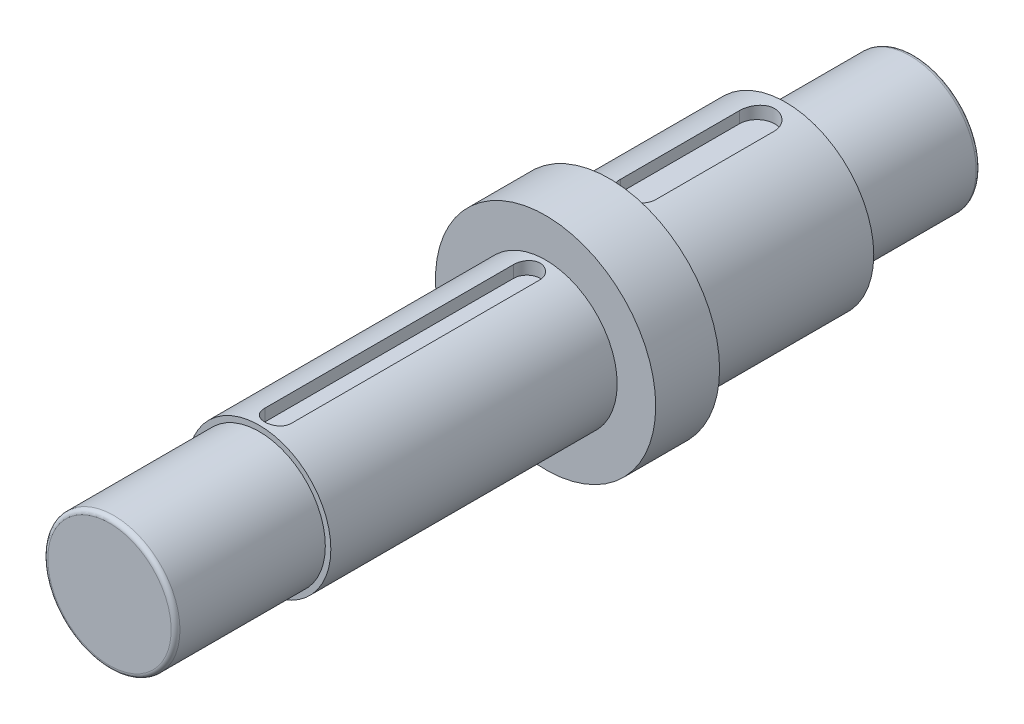
ISO-10303-21;
HEADER;
FILE_DESCRIPTION(('STEP AP214'),'2;1');
FILE_NAME('part.step','',(''),(''),'','','');
FILE_SCHEMA(('AUTOMOTIVE_DESIGN { 1 0 10303 214 1 1 1 1 }'));
ENDSEC;
DATA;
#1=APPLICATION_CONTEXT('core data for automotive mechanical design processes');
#2=APPLICATION_PROTOCOL_DEFINITION('international standard','automotive_design',2000,#1);
#3=PRODUCT_CONTEXT('',#1,'mechanical');
#4=PRODUCT('Part','Part','',(#3));
#5=PRODUCT_RELATED_PRODUCT_CATEGORY('part','',(#4));
#6=PRODUCT_DEFINITION_FORMATION('','',#4);
#7=PRODUCT_DEFINITION_CONTEXT('part definition',#1,'design');
#8=PRODUCT_DEFINITION('design','',#6,#7);
#9=PRODUCT_DEFINITION_SHAPE('','',#8);
#10=(LENGTH_UNIT() NAMED_UNIT(*) SI_UNIT(.MILLI.,.METRE.));
#11=(NAMED_UNIT(*) PLANE_ANGLE_UNIT() SI_UNIT($,.RADIAN.));
#12=(NAMED_UNIT(*) SI_UNIT($,.STERADIAN.) SOLID_ANGLE_UNIT());
#13=UNCERTAINTY_MEASURE_WITH_UNIT(LENGTH_MEASURE(1.E-05),#10,'distance_accuracy_value','');
#14=(GEOMETRIC_REPRESENTATION_CONTEXT(3) GLOBAL_UNCERTAINTY_ASSIGNED_CONTEXT((#13)) GLOBAL_UNIT_ASSIGNED_CONTEXT((#10,
#11,#12)) REPRESENTATION_CONTEXT('',''));
#15=CARTESIAN_POINT('',(0.,0.,0.));
#16=DIRECTION('',(0.,0.,1.));
#17=DIRECTION('',(1.,0.,0.));
#18=AXIS2_PLACEMENT_3D('',#15,#16,#17);
#19=CARTESIAN_POINT('',(0.,0.,0.));
#20=DIRECTION('',(0.,0.,1.));
#21=DIRECTION('',(1.,0.,0.));
#22=AXIS2_PLACEMENT_3D('',#19,#20,#21);
#23=CYLINDRICAL_SURFACE('',#22,32.5);
#24=CARTESIAN_POINT('',(0.,0.,167.5));
#25=DIRECTION('',(0.,0.,1.));
#26=DIRECTION('',(1.,0.,0.));
#27=AXIS2_PLACEMENT_3D('',#24,#25,#26);
#28=CIRCLE('',#27,32.5);
#29=CARTESIAN_POINT('',(32.5,0.,167.5));
#30=VERTEX_POINT('',#29);
#31=EDGE_CURVE('E171',#30,#30,#28,.T.);
#32=ORIENTED_EDGE('',*,*,#31,.T.);
#33=EDGE_LOOP('',(#32));
#34=FACE_BOUND('',#33,.T.);
#35=CARTESIAN_POINT('',(0.,0.,297.5));
#36=DIRECTION('',(0.,0.,1.));
#37=DIRECTION('',(1.,0.,0.));
#38=AXIS2_PLACEMENT_3D('',#35,#36,#37);
#39=CIRCLE('',#38,32.5);
#40=CARTESIAN_POINT('',(32.5,0.,297.5));
#41=VERTEX_POINT('',#40);
#42=EDGE_CURVE('E172',#41,#41,#39,.T.);
#43=ORIENTED_EDGE('',*,*,#42,.F.);
#44=EDGE_LOOP('',(#43));
#45=FACE_BOUND('',#44,.T.);
#46=CARTESIAN_POINT('',(5.99999999999991,31.9413525073689,176.));
#47=CARTESIAN_POINT('',(6.00001972804641,31.9413387857947,175.832781755872));
#48=CARTESIAN_POINT('',(5.9930103732358,31.9426651643651,175.665568298779));
#49=CARTESIAN_POINT('',(5.96507748310387,31.9478985744651,175.33236641655));
#50=CARTESIAN_POINT('',(5.94415550928292,31.951805316384,175.16637785605));
#51=CARTESIAN_POINT('',(5.88858022552652,31.9620927431616,174.837033794825));
#52=CARTESIAN_POINT('',(5.85394617497402,31.9684699578331,174.673674934018));
#53=CARTESIAN_POINT('',(5.77122142179083,31.9835079502799,174.350509489182));
#54=CARTESIAN_POINT('',(5.72313069754881,31.9921687317226,174.190702910859));
#55=CARTESIAN_POINT('',(5.6138585652119,32.0115239309396,173.87576503055));
#56=CARTESIAN_POINT('',(5.55267764101723,32.0222182735384,173.720633555985));
#57=CARTESIAN_POINT('',(5.41765280752458,32.0453386476663,173.41604968961));
#58=CARTESIAN_POINT('',(5.34380421506806,32.0577653193071,173.26659942316));
#59=CARTESIAN_POINT('',(5.18401841837613,32.0839913654135,172.974498719593));
#60=CARTESIAN_POINT('',(5.09808515477464,32.0977902919789,172.831846086089));
#61=CARTESIAN_POINT('',(4.91468141870748,32.126383548917,172.554190990731));
#62=CARTESIAN_POINT('',(4.81720664599399,32.1411782494131,172.419191408204));
#63=CARTESIAN_POINT('',(4.61035013215909,32.1715045920759,172.156444905818));
#64=CARTESIAN_POINT('',(4.500855772139,32.187042269054,172.028787333283));
#65=CARTESIAN_POINT('',(4.27151002693483,32.2182804790527,171.783075009634));
#66=CARTESIAN_POINT('',(4.15165482004194,32.2339810702705,171.665023833381));
#67=CARTESIAN_POINT('',(3.90246404243743,32.2650977553358,171.439405957197));
#68=CARTESIAN_POINT('',(3.77313048808002,32.280513908824,171.331837038625));
#69=CARTESIAN_POINT('',(3.50578787076281,32.3106414262999,171.127861732948));
#70=CARTESIAN_POINT('',(3.36777562726992,32.3253525283815,171.031459475376));
#71=CARTESIAN_POINT('',(3.08306099946307,32.3537531221654,170.84990878919));
#72=CARTESIAN_POINT('',(2.936304463415,32.3674347266049,170.764844016585));
#73=CARTESIAN_POINT('',(2.63595403307188,32.39327817288,170.607365279224));
#74=CARTESIAN_POINT('',(2.48235760661719,32.4054394454306,170.534956049293));
#75=CARTESIAN_POINT('',(2.16953912880609,32.4278842146267,170.403404977647));
#76=CARTESIAN_POINT('',(2.01031985951629,32.43816862479,170.344256678271));
#77=CARTESIAN_POINT('',(1.6872662257965,32.4565758245332,170.239620637345));
#78=CARTESIAN_POINT('',(1.52343020954708,32.4646978292852,170.19413785482));
#79=CARTESIAN_POINT('',(1.19428937290297,32.4784619635949,170.117662795038));
#80=CARTESIAN_POINT('',(1.02902285551296,32.4841314254946,170.08651054924));
#81=CARTESIAN_POINT('',(0.696389660835666,32.4929641670952,170.038180964307));
#82=CARTESIAN_POINT('',(0.529022963736015,32.4961274231355,170.021003757107));
#83=CARTESIAN_POINT('',(0.193419088173478,32.4998576642738,170.000762755366));
#84=CARTESIAN_POINT('',(0.0251819603747735,32.5004247988165,169.997698148437));
#85=CARTESIAN_POINT('',(-0.310943540652088,32.4989470467579,170.005704820769));
#86=CARTESIAN_POINT('',(-0.4788319159249,32.4969021755137,170.016776016919));
#87=CARTESIAN_POINT('',(-0.811000792294051,32.4902991463823,170.052744707521));
#88=CARTESIAN_POINT('',(-0.975300336608197,32.4857718718836,170.077472330134));
#89=CARTESIAN_POINT('',(-1.3012016725665,32.4743508081301,170.140442175259));
#90=CARTESIAN_POINT('',(-1.46280351116901,32.4674570601131,170.178684162273));
#91=CARTESIAN_POINT('',(-1.78221456789494,32.4514913115269,170.268400289348));
#92=CARTESIAN_POINT('',(-1.94002302319782,32.4424188768056,170.319877066883));
#93=CARTESIAN_POINT('',(-2.25067218859326,32.422348706553,170.435654353196));
#94=CARTESIAN_POINT('',(-2.40351461351373,32.4113516441784,170.499950379413));
#95=CARTESIAN_POINT('',(-2.70413221736005,32.3876602669359,170.641322955232));
#96=CARTESIAN_POINT('',(-2.85187246890169,32.3749563872849,170.718472164102));
#97=CARTESIAN_POINT('',(-3.14028729035266,32.3482544525693,170.884700366781));
#98=CARTESIAN_POINT('',(-3.28096432628655,32.3342568541064,170.973775156549));
#99=CARTESIAN_POINT('',(-3.55442520770943,32.3053397564869,171.163291713638));
#100=CARTESIAN_POINT('',(-3.68720582162271,32.2904198849195,171.26373808656));
#101=CARTESIAN_POINT('',(-3.94388427294111,32.2600755738219,171.475243396471));
#102=CARTESIAN_POINT('',(-4.06778521841465,32.2446513136185,171.586298588086));
#103=CARTESIAN_POINT('',(-4.30773837389128,32.2134793446507,171.820063598722));
#104=CARTESIAN_POINT('',(-4.42364336885938,32.1977302742279,171.942924401806));
#105=CARTESIAN_POINT('',(-4.64466655714656,32.166590238664,172.197956367049));
#106=CARTESIAN_POINT('',(-4.74978862891945,32.1511991463148,172.330124152576));
#107=CARTESIAN_POINT('',(-4.94862562431096,32.1211958688334,172.60299810796));
#108=CARTESIAN_POINT('',(-5.04233297220692,32.1065842045683,172.743709856458));
#109=CARTESIAN_POINT('',(-5.21755652220308,32.0785750424357,173.03257199706));
#110=CARTESIAN_POINT('',(-5.29907734790028,32.0651770848488,173.180719539362));
#111=CARTESIAN_POINT('',(-5.4495670127457,32.0399447422428,173.483866269052));
#112=CARTESIAN_POINT('',(-5.51850301951117,32.0281144685451,173.638882103259));
#113=CARTESIAN_POINT('',(-5.64301783414208,32.0064110019808,173.954253678406));
#114=CARTESIAN_POINT('',(-5.69860183057835,31.996537049153,174.114607317412));
#115=CARTESIAN_POINT('',(-5.79596382074337,31.9790439211199,174.439386223656));
#116=CARTESIAN_POINT('',(-5.83775626999942,31.9714223859376,174.60380703229));
#117=CARTESIAN_POINT('',(-5.90726811971032,31.9586519303727,174.935623501661));
#118=CARTESIAN_POINT('',(-5.9349942414404,31.9535018291353,175.103017701979));
#119=CARTESIAN_POINT('',(-5.97038248093272,31.9469053541025,175.392231253542));
#120=CARTESIAN_POINT('',(-5.98149459292176,31.9448246568417,175.513625510117));
#121=CARTESIAN_POINT('',(-5.99629903533955,31.9420477031673,175.756676055159));
#122=CARTESIAN_POINT('',(-6.00000382610286,31.9413491218277,175.878331558387));
#123=CARTESIAN_POINT('',(-5.99999999999999,31.9413525073689,176.));
#124=B_SPLINE_CURVE_WITH_KNOTS('',3,(#46,#47,#48,#49,#50,#51,#52,#53,#54,#55,#56,#57,#58,#59,
#60,#61,#62,#63,#64,#65,#66,#67,#68,#69,#70,#71,#72,#73,#74,#75,#76,#77,#78,#79,#80,#81,#82,#83,
#84,#85,#86,#87,#88,#89,#90,#91,#92,#93,#94,#95,#96,#97,#98,#99,#100,#101,#102,#103,#104,#105,
#106,#107,#108,#109,#110,#111,#112,#113,#114,#115,#116,#117,#118,#119,#120,#121,#122,#123),
.UNSPECIFIED.,.F.,.F.,(4,2,2,2,2,2,2,2,2,2,2,2,2,2,2,2,2,2,2,2,2,2,2,2,2,2,2,2,2,2,2,2,2,2,2,2,
2,2,4),(0.,0.501495470760242,1.00293466504055,1.50367204425038,2.0044102276453,2.50512990364764,
3.00603509315038,3.50677732194071,4.0077067127393,4.51381178473909,5.02010434213718,
5.52628950547204,6.03266126710335,6.54258387789146,7.05269685982352,7.5625608904048,
8.07260972061943,8.57681791670589,9.08103087289818,9.58521480389387,10.0893957705871,
10.5874420693422,11.0854796896586,11.5836166376145,12.08157970439,12.5824597292726,
13.083163645103,13.5840710813184,14.0848023244559,14.5931139762334,15.1012421501451,
15.6097057420661,16.117975929331,16.6275537557709,17.136933239535,17.6457771118127,
18.1543776150575,18.5199145679152,18.8848361083195),.UNSPECIFIED.);
#125=CARTESIAN_POINT('',(5.99999999999994,31.9413525073689,176.));
#126=VERTEX_POINT('',#125);
#127=CARTESIAN_POINT('',(-5.99999999999996,31.9413525073689,176.));
#128=VERTEX_POINT('',#127);
#129=EDGE_CURVE('E11',#126,#128,#124,.T.);
#130=ORIENTED_EDGE('',*,*,#129,.F.);
#131=DIRECTION('',(0.,0.,1.));
#132=VECTOR('',#131,1.);
#133=CARTESIAN_POINT('',(5.99999999999991,31.9413525073689,0.));
#134=LINE('',#133,#132);
#135=CARTESIAN_POINT('',(5.99999999999991,31.9413525073689,289.));
#136=VERTEX_POINT('',#135);
#137=EDGE_CURVE('E233',#136,#126,#134,.F.);
#138=ORIENTED_EDGE('',*,*,#137,.F.);
#139=CARTESIAN_POINT('',(-5.99999999999997,31.9413525073689,289.));
#140=CARTESIAN_POINT('',(-6.00001972804647,31.9413387857947,289.167218244128));
#141=CARTESIAN_POINT('',(-5.99301037323586,31.9426651643651,289.334431701221));
#142=CARTESIAN_POINT('',(-5.96507748310392,31.9478985744651,289.66763358345));
#143=CARTESIAN_POINT('',(-5.94415550928297,31.951805316384,289.83362214395));
#144=CARTESIAN_POINT('',(-5.88858022552657,31.9620927431616,290.162966205175));
#145=CARTESIAN_POINT('',(-5.85394617497407,31.9684699578331,290.326325065982));
#146=CARTESIAN_POINT('',(-5.77122142179087,31.9835079502799,290.649490510818));
#147=CARTESIAN_POINT('',(-5.72313069754886,31.9921687317226,290.809297089141));
#148=CARTESIAN_POINT('',(-5.61385856521194,32.0115239309396,291.12423496945));
#149=CARTESIAN_POINT('',(-5.55267764101726,32.0222182735384,291.279366444015));
#150=CARTESIAN_POINT('',(-5.41765280752461,32.0453386476662,291.58395031039));
#151=CARTESIAN_POINT('',(-5.34380421506808,32.0577653193071,291.733400576841));
#152=CARTESIAN_POINT('',(-5.18401841837614,32.0839913654135,292.025501280407));
#153=CARTESIAN_POINT('',(-5.09808515477463,32.0977902919789,292.168153913911));
#154=CARTESIAN_POINT('',(-4.91468141870748,32.126383548917,292.445809009269));
#155=CARTESIAN_POINT('',(-4.81720664599399,32.1411782494131,292.580808591796));
#156=CARTESIAN_POINT('',(-4.61035013215911,32.1715045920759,292.843555094182));
#157=CARTESIAN_POINT('',(-4.50085577213901,32.187042269054,292.971212666717));
#158=CARTESIAN_POINT('',(-4.27151002693485,32.2182804790527,293.216924990366));
#159=CARTESIAN_POINT('',(-4.15165482004196,32.2339810702705,293.33497616662));
#160=CARTESIAN_POINT('',(-3.90246404243746,32.2650977553358,293.560594042803));
#161=CARTESIAN_POINT('',(-3.77313048808004,32.280513908824,293.668162961375));
#162=CARTESIAN_POINT('',(-3.50578787076284,32.3106414262999,293.872138267052));
#163=CARTESIAN_POINT('',(-3.36777562726996,32.3253525283815,293.968540524624));
#164=CARTESIAN_POINT('',(-3.08306099946311,32.3537531221654,294.15009121081));
#165=CARTESIAN_POINT('',(-2.93630446341504,32.3674347266048,294.235155983415));
#166=CARTESIAN_POINT('',(-2.6359540330719,32.39327817288,294.392634720776));
#167=CARTESIAN_POINT('',(-2.48235760661721,32.4054394454306,294.465043950707));
#168=CARTESIAN_POINT('',(-2.1695391288061,32.4278842146267,294.596595022353));
#169=CARTESIAN_POINT('',(-2.0103198595163,32.43816862479,294.655743321729));
#170=CARTESIAN_POINT('',(-1.68726622579652,32.4565758245332,294.760379362655));
#171=CARTESIAN_POINT('',(-1.52343020954711,32.4646978292852,294.80586214518));
#172=CARTESIAN_POINT('',(-1.19428937290301,32.4784619635949,294.882337204962));
#173=CARTESIAN_POINT('',(-1.029022855513,32.4841314254946,294.91348945076));
#174=CARTESIAN_POINT('',(-0.696389660835696,32.4929641670952,294.961819035693));
#175=CARTESIAN_POINT('',(-0.529022963736039,32.4961274231355,294.978996242893));
#176=CARTESIAN_POINT('',(-0.193419088173493,32.4998576642738,294.999237244634));
#177=CARTESIAN_POINT('',(-0.0251819603747849,32.5004247988165,295.002301851563));
#178=CARTESIAN_POINT('',(0.310943540652082,32.4989470467579,294.994295179231));
#179=CARTESIAN_POINT('',(0.478831915924895,32.4969021755137,294.983223983081));
#180=CARTESIAN_POINT('',(0.811000792294054,32.4902991463823,294.947255292478));
#181=CARTESIAN_POINT('',(0.975300336608206,32.4857718718836,294.922527669866));
#182=CARTESIAN_POINT('',(1.30120167256651,32.4743508081301,294.859557824741));
#183=CARTESIAN_POINT('',(1.46280351116901,32.4674570601131,294.821315837727));
#184=CARTESIAN_POINT('',(1.78221456789493,32.4514913115269,294.731599710652));
#185=CARTESIAN_POINT('',(1.9400230231978,32.4424188768056,294.680122933117));
#186=CARTESIAN_POINT('',(2.25067218859324,32.422348706553,294.564345646804));
#187=CARTESIAN_POINT('',(2.40351461351371,32.4113516441784,294.500049620587));
#188=CARTESIAN_POINT('',(2.70413221736002,32.3876602669359,294.358677044768));
#189=CARTESIAN_POINT('',(2.85187246890166,32.3749563872849,294.281527835897));
#190=CARTESIAN_POINT('',(3.14028729035262,32.3482544525693,294.115299633219));
#191=CARTESIAN_POINT('',(3.28096432628651,32.3342568541064,294.026224843451));
#192=CARTESIAN_POINT('',(3.55442520770939,32.3053397564869,293.836708286362));
#193=CARTESIAN_POINT('',(3.68720582162266,32.2904198849195,293.73626191344));
#194=CARTESIAN_POINT('',(3.94388427294107,32.2600755738219,293.524756603529));
#195=CARTESIAN_POINT('',(4.06778521841462,32.2446513136185,293.413701411914));
#196=CARTESIAN_POINT('',(4.30773837389127,32.2134793446507,293.179936401278));
#197=CARTESIAN_POINT('',(4.42364336885937,32.1977302742279,293.057075598194));
#198=CARTESIAN_POINT('',(4.64466655714654,32.166590238664,292.802043632951));
#199=CARTESIAN_POINT('',(4.74978862891943,32.1511991463148,292.669875847424));
#200=CARTESIAN_POINT('',(4.94862562431094,32.1211958688334,292.39700189204));
#201=CARTESIAN_POINT('',(5.04233297220689,32.1065842045684,292.256290143541));
#202=CARTESIAN_POINT('',(5.21755652220306,32.0785750424357,291.96742800294));
#203=CARTESIAN_POINT('',(5.29907734790027,32.0651770848488,291.819280460638));
#204=CARTESIAN_POINT('',(5.44956701274567,32.0399447422428,291.516133730948));
#205=CARTESIAN_POINT('',(5.51850301951113,32.0281144685451,291.361117896741));
#206=CARTESIAN_POINT('',(5.64301783414201,32.0064110019808,291.045746321594));
#207=CARTESIAN_POINT('',(5.6986018305783,31.996537049153,290.885392682588));
#208=CARTESIAN_POINT('',(5.79596382074332,31.9790439211199,290.560613776344));
#209=CARTESIAN_POINT('',(5.83775626999936,31.9714223859376,290.39619296771));
#210=CARTESIAN_POINT('',(5.90726811971026,31.9586519303727,290.064376498339));
#211=CARTESIAN_POINT('',(5.93499424144035,31.9535018291353,289.896982298021));
#212=CARTESIAN_POINT('',(5.97038248093266,31.9469053541026,289.607768746458));
#213=CARTESIAN_POINT('',(5.9814945929217,31.9448246568418,289.486374489883));
#214=CARTESIAN_POINT('',(5.9962990353395,31.9420477031673,289.243323944841));
#215=CARTESIAN_POINT('',(6.00000382610281,31.9413491218277,289.121668441613));
#216=CARTESIAN_POINT('',(5.99999999999993,31.9413525073689,289.));
#217=B_SPLINE_CURVE_WITH_KNOTS('',3,(#139,#140,#141,#142,#143,#144,#145,#146,#147,#148,#149,
#150,#151,#152,#153,#154,#155,#156,#157,#158,#159,#160,#161,#162,#163,#164,#165,#166,#167,#168,
#169,#170,#171,#172,#173,#174,#175,#176,#177,#178,#179,#180,#181,#182,#183,#184,#185,#186,#187,
#188,#189,#190,#191,#192,#193,#194,#195,#196,#197,#198,#199,#200,#201,#202,#203,#204,#205,#206,
#207,#208,#209,#210,#211,#212,#213,#214,#215,#216),.UNSPECIFIED.,.F.,.F.,(4,2,2,2,2,2,2,2,2,2,2,
2,2,2,2,2,2,2,2,2,2,2,2,2,2,2,2,2,2,2,2,2,2,2,2,2,2,2,4),(0.,0.501495470760297,1.00293466504058,
1.50367204425046,2.00441022764533,2.5051299036477,3.00603509315047,3.50677732194082,
4.00770671273937,4.51381178473916,5.02010434213722,5.52628950547208,6.03266126710339,
6.54258387789147,7.05269685982357,7.56256089040485,8.07260972061946,8.5768179167059,
9.08103087289821,9.58521480389392,10.0893957705872,10.5874420693423,11.0854796896587,
11.5836166376145,12.0815797043901,12.5824597292726,13.083163645103,13.5840710813184,
14.0848023244559,14.5931139762334,15.1012421501452,15.6097057420662,16.117975929331,
16.6275537557709,17.1369332395349,17.6457771118127,18.1543776150576,18.5199145679151,
18.8848361083195),.UNSPECIFIED.);
#218=CARTESIAN_POINT('',(-5.99999999999997,31.9413525073689,289.));
#219=VERTEX_POINT('',#218);
#220=EDGE_CURVE('E234',#219,#136,#217,.T.);
#221=ORIENTED_EDGE('',*,*,#220,.F.);
#222=DIRECTION('',(0.,0.,1.));
#223=VECTOR('',#222,1.);
#224=CARTESIAN_POINT('',(-5.99999999999999,31.9413525073689,0.));
#225=LINE('',#224,#223);
#226=EDGE_CURVE('E51',#128,#219,#225,.T.);
#227=ORIENTED_EDGE('',*,*,#226,.F.);
#228=EDGE_LOOP('',(#130,#138,#221,#227));
#229=FACE_BOUND('',#228,.T.);
#230=ADVANCED_FACE('F40',(#34,#45,#229),#23,.T.);
#231=CARTESIAN_POINT('',(0.,0.,0.));
#232=DIRECTION('',(0.,0.,1.));
#233=DIRECTION('',(1.,0.,0.));
#234=AXIS2_PLACEMENT_3D('',#231,#232,#233);
#235=CYLINDRICAL_SURFACE('',#234,40.);
#236=CARTESIAN_POINT('',(0.,0.,58.5));
#237=DIRECTION('',(0.,0.,1.));
#238=DIRECTION('',(1.,0.,0.));
#239=AXIS2_PLACEMENT_3D('',#236,#237,#238);
#240=CIRCLE('',#239,40.);
#241=CARTESIAN_POINT('',(40.,0.,58.5));
#242=VERTEX_POINT('',#241);
#243=EDGE_CURVE('E159',#242,#242,#240,.T.);
#244=ORIENTED_EDGE('',*,*,#243,.T.);
#245=EDGE_LOOP('',(#244));
#246=FACE_BOUND('',#245,.T.);
#247=CARTESIAN_POINT('',(0.,0.,138.5));
#248=DIRECTION('',(0.,0.,1.));
#249=DIRECTION('',(1.,0.,0.));
#250=AXIS2_PLACEMENT_3D('',#247,#248,#249);
#251=CIRCLE('',#250,40.);
#252=CARTESIAN_POINT('',(40.,0.,138.5));
#253=VERTEX_POINT('',#252);
#254=EDGE_CURVE('E162',#253,#253,#251,.T.);
#255=ORIENTED_EDGE('',*,*,#254,.F.);
#256=EDGE_LOOP('',(#255));
#257=FACE_BOUND('',#256,.T.);
#258=CARTESIAN_POINT('',(7.99999999999996,39.1918358845309,71.5));
#259=CARTESIAN_POINT('',(8.00002666922668,39.1918159431797,71.2773994773631));
#260=CARTESIAN_POINT('',(7.99071035587004,39.1937316873133,71.0548058559555));
#261=CARTESIAN_POINT('',(7.95358673509773,39.2012897767833,70.6112562503618));
#262=CARTESIAN_POINT('',(7.92578171511928,39.2069316611182,70.3903000670098));
#263=CARTESIAN_POINT('',(7.85193172751173,39.2217860307119,69.9519267033541));
#264=CARTESIAN_POINT('',(7.80591454667937,39.2309930760462,69.7345046546017));
#265=CARTESIAN_POINT('',(7.6960105112746,39.2527015332246,69.3043945517376));
#266=CARTESIAN_POINT('',(7.63212358375307,39.2652029585174,69.0917065169553));
#267=CARTESIAN_POINT('',(7.48697595827944,39.2931373309787,68.6725672642705));
#268=CARTESIAN_POINT('',(7.40571689392711,39.3085700024906,68.4661154620218));
#269=CARTESIAN_POINT('',(7.22639517936945,39.3419309258448,68.0607634761196));
#270=CARTESIAN_POINT('',(7.12832631202955,39.359860100561,67.8618661198586));
#271=CARTESIAN_POINT('',(6.9161440468189,39.3976973294659,67.473092957701));
#272=CARTESIAN_POINT('',(6.80203505304725,39.4176048400293,67.2832146945358));
#273=CARTESIAN_POINT('',(6.55850947336996,39.4588545756894,66.9136125839657));
#274=CARTESIAN_POINT('',(6.42908748099434,39.4801973063558,66.7338923562906));
#275=CARTESIAN_POINT('',(6.15415578885209,39.5239924026978,66.3836992170384));
#276=CARTESIAN_POINT('',(6.00846658612044,39.5464552423725,66.2133685158621));
#277=CARTESIAN_POINT('',(5.70333270732971,39.5916124451561,65.8855417537508));
#278=CARTESIAN_POINT('',(5.54388793819493,39.6143068098307,65.7280457796746));
#279=CARTESIAN_POINT('',(5.21226662634081,39.6593025376983,65.4269071968093));
#280=CARTESIAN_POINT('',(5.0400860521929,39.6816037736592,65.2832690080446));
#281=CARTESIAN_POINT('',(4.6842537554729,39.7251794083479,65.0109364355222));
#282=CARTESIAN_POINT('',(4.50060577967097,39.7464541384826,64.8822372096095));
#283=CARTESIAN_POINT('',(4.12134325254234,39.7875762988249,64.6395582052914));
#284=CARTESIAN_POINT('',(3.92563673340869,39.8074093383913,64.5257196477843));
#285=CARTESIAN_POINT('',(3.52511574724929,39.8448742915997,64.3149623081856));
#286=CARTESIAN_POINT('',(3.32030141044038,39.8625062366975,64.2180432842886));
#287=CARTESIAN_POINT('',(2.90302705629154,39.8950650833092,64.0418691041571));
#288=CARTESIAN_POINT('',(2.690567847596,39.9099922699196,63.9626120860474));
#289=CARTESIAN_POINT('',(2.25951457252046,39.9367151389395,63.8223728290361));
#290=CARTESIAN_POINT('',(2.04092072388619,39.948510932341,63.7613899423989));
#291=CARTESIAN_POINT('',(1.6020566050941,39.9685005509805,63.6588563748557));
#292=CARTESIAN_POINT('',(1.3818448434766,39.9767391064403,63.6170639331187));
#293=CARTESIAN_POINT('',(0.938668501096503,39.9895989229295,63.5521048244742));
#294=CARTESIAN_POINT('',(0.715704977800294,39.9942215320969,63.528931215795));
#295=CARTESIAN_POINT('',(0.268546453942566,39.9997235457757,63.5013709436081));
#296=CARTESIAN_POINT('',(0.0443513071851338,40.0006024958556,63.4969865608674));
#297=CARTESIAN_POINT('',(-0.403598136420523,39.998590885801,63.5070470189472));
#298=CARTESIAN_POINT('',(-0.627352436688717,39.9957003550254,63.5214917131161));
#299=CARTESIAN_POINT('',(-1.06956087762931,39.9863007164749,63.5687472698706));
#300=CARTESIAN_POINT('',(-1.28804488719503,39.9798444941963,63.6012897581708));
#301=CARTESIAN_POINT('',(-1.72152774938216,39.9635259160648,63.6843068948711));
#302=CARTESIAN_POINT('',(-1.93652536613346,39.9536623788616,63.7347877628625));
#303=CARTESIAN_POINT('',(-2.36138711377734,39.9308038729487,63.8532704931489));
#304=CARTESIAN_POINT('',(-2.57125292637828,39.9178099456462,63.9212665290794));
#305=CARTESIAN_POINT('',(-2.98456033438454,39.8890377494063,64.0743028246649));
#306=CARTESIAN_POINT('',(-3.18799963056057,39.8732584969652,64.1593491062397));
#307=CARTESIAN_POINT('',(-3.58823088504013,39.839241787259,64.3464209443809));
#308=CARTESIAN_POINT('',(-3.78497444405911,39.8209898525271,64.4485473994331));
#309=CARTESIAN_POINT('',(-4.16917750443027,39.7825996820114,64.6686766972977));
#310=CARTESIAN_POINT('',(-4.35663686412197,39.7624614174589,64.7866797822573));
#311=CARTESIAN_POINT('',(-4.7210696357989,39.7208402552586,65.0377654019578));
#312=CARTESIAN_POINT('',(-4.89804077202868,39.6993570678511,65.1708511912621));
#313=CARTESIAN_POINT('',(-5.24023924452892,39.6556382273803,65.4511328809067));
#314=CARTESIAN_POINT('',(-5.40547013631541,39.6334028051675,65.5983244773327));
#315=CARTESIAN_POINT('',(-5.72594829962104,39.5883841709058,65.9085672169155));
#316=CARTESIAN_POINT('',(-5.88097018343544,39.5655981831912,66.0718508738712));
#317=CARTESIAN_POINT('',(-6.1767327183542,39.52050553126,66.4109346312084));
#318=CARTESIAN_POINT('',(-6.31747353175153,39.4981988615986,66.5867345893135));
#319=CARTESIAN_POINT('',(-6.58373833819255,39.4546904604362,66.9497178575182));
#320=CARTESIAN_POINT('',(-6.70925765808143,39.4334890694003,67.1369046371365));
#321=CARTESIAN_POINT('',(-6.94413000109325,39.3928073388215,67.5213326337773));
#322=CARTESIAN_POINT('',(-7.05348345869363,39.3733269530302,67.7185735803901));
#323=CARTESIAN_POINT('',(-7.25551976501701,39.3365988941848,68.1223463687289));
#324=CARTESIAN_POINT('',(-7.34815287597922,39.319357923992,68.328903717907));
#325=CARTESIAN_POINT('',(-7.51561296401807,39.2876930641819,68.7492329719979));
#326=CARTESIAN_POINT('',(-7.59044689691486,39.2732680744913,68.9630020212031));
#327=CARTESIAN_POINT('',(-7.72169650413227,39.2476734918111,69.3960643964984));
#328=CARTESIAN_POINT('',(-7.77813137524138,39.2365005071337,69.6153517060011));
#329=CARTESIAN_POINT('',(-7.8722129784336,39.217732786038,70.0579800459995));
#330=CARTESIAN_POINT('',(-7.90986864539154,39.2101363480467,70.2813190962134));
#331=CARTESIAN_POINT('',(-7.95864886653906,39.200259679954,70.6708147229986));
#332=CARTESIAN_POINT('',(-7.97416273216954,39.1971035385051,70.8364132290699));
#333=CARTESIAN_POINT('',(-7.99483261811853,39.192890643088,71.168002768873));
#334=CARTESIAN_POINT('',(-8.00000597259349,39.1918303757664,71.333992677912));
#335=CARTESIAN_POINT('',(-7.99999999999999,39.1918358845308,71.5));
#336=B_SPLINE_CURVE_WITH_KNOTS('',3,(#258,#259,#260,#261,#262,#263,#264,#265,#266,#267,#268,
#269,#270,#271,#272,#273,#274,#275,#276,#277,#278,#279,#280,#281,#282,#283,#284,#285,#286,#287,
#288,#289,#290,#291,#292,#293,#294,#295,#296,#297,#298,#299,#300,#301,#302,#303,#304,#305,#306,
#307,#308,#309,#310,#311,#312,#313,#314,#315,#316,#317,#318,#319,#320,#321,#322,#323,#324,#325,
#326,#327,#328,#329,#330,#331,#332,#333,#334,#335),.UNSPECIFIED.,.F.,.F.,(4,2,2,2,2,2,2,2,2,2,2,
2,2,2,2,2,2,2,2,2,2,2,2,2,2,2,2,2,2,2,2,2,2,2,2,2,2,2,4),(0.,0.667588082863367,1.33509358657229,
2.00158456075836,2.66807825577952,3.3345093041942,4.00118736722488,4.66768273830515,
5.33441413112672,6.00940860933874,6.68440765519393,7.3596212891945,8.03461545192918,
8.71561799719683,9.39661080912295,10.0775317988518,10.7584286501498,11.4304948903323,
12.1023104435848,12.7742075441763,13.4460994116817,14.108283619839,14.7706976447376,
15.4328916036424,16.0953198539646,16.7618092594033,17.4283088311614,18.0949524957899,
18.7613934001529,19.4395000800169,20.1175990528765,20.7959056848448,21.4741940831724,
22.1544680675848,22.8344757662838,23.5137716866302,24.1927440986813,24.6914848131908,
25.1893887678565),.UNSPECIFIED.);
#337=CARTESIAN_POINT('',(7.99999999999997,39.1918358845309,71.5));
#338=VERTEX_POINT('',#337);
#339=CARTESIAN_POINT('',(-7.99999999999998,39.1918358845308,71.5));
#340=VERTEX_POINT('',#339);
#341=EDGE_CURVE('E226',#338,#340,#336,.T.);
#342=ORIENTED_EDGE('',*,*,#341,.F.);
#343=DIRECTION('',(0.,0.,1.));
#344=VECTOR('',#343,1.);
#345=CARTESIAN_POINT('',(7.99999999999996,39.1918358845309,0.));
#346=LINE('',#345,#344);
#347=CARTESIAN_POINT('',(7.99999999999996,39.1918358845309,125.5));
#348=VERTEX_POINT('',#347);
#349=EDGE_CURVE('E193',#348,#338,#346,.F.);
#350=ORIENTED_EDGE('',*,*,#349,.F.);
#351=CARTESIAN_POINT('',(-7.99999999999998,39.1918358845308,125.5));
#352=CARTESIAN_POINT('',(-8.00002666922671,39.1918159431797,125.722600522637));
#353=CARTESIAN_POINT('',(-7.99071035587006,39.1937316873133,125.945194144045));
#354=CARTESIAN_POINT('',(-7.95358673509776,39.2012897767833,126.388743749638));
#355=CARTESIAN_POINT('',(-7.92578171511931,39.2069316611182,126.60969993299));
#356=CARTESIAN_POINT('',(-7.85193172751176,39.2217860307119,127.048073296646));
#357=CARTESIAN_POINT('',(-7.80591454667941,39.2309930760462,127.265495345398));
#358=CARTESIAN_POINT('',(-7.69601051127463,39.2527015332246,127.695605448262));
#359=CARTESIAN_POINT('',(-7.6321235837531,39.2652029585174,127.908293483045));
#360=CARTESIAN_POINT('',(-7.48697595827946,39.2931373309787,128.32743273573));
#361=CARTESIAN_POINT('',(-7.40571689392713,39.3085700024906,128.533884537978));
#362=CARTESIAN_POINT('',(-7.22639517936946,39.3419309258448,128.93923652388));
#363=CARTESIAN_POINT('',(-7.12832631202956,39.359860100561,129.138133880141));
#364=CARTESIAN_POINT('',(-6.91614404681891,39.3976973294659,129.526907042299));
#365=CARTESIAN_POINT('',(-6.80203505304726,39.4176048400293,129.716785305464));
#366=CARTESIAN_POINT('',(-6.55850947336998,39.4588545756894,130.086387416034));
#367=CARTESIAN_POINT('',(-6.42908748099436,39.4801973063558,130.266107643709));
#368=CARTESIAN_POINT('',(-6.15415578885211,39.5239924026978,130.616300782962));
#369=CARTESIAN_POINT('',(-6.00846658612045,39.5464552423725,130.786631484138));
#370=CARTESIAN_POINT('',(-5.70333270732972,39.5916124451561,131.114458246249));
#371=CARTESIAN_POINT('',(-5.54388793819493,39.6143068098307,131.271954220325));
#372=CARTESIAN_POINT('',(-5.21226662634083,39.6593025376983,131.573092803191));
#373=CARTESIAN_POINT('',(-5.04008605219292,39.6816037736592,131.716730991955));
#374=CARTESIAN_POINT('',(-4.68425375547293,39.7251794083479,131.989063564478));
#375=CARTESIAN_POINT('',(-4.50060577967099,39.7464541384826,132.117762790391));
#376=CARTESIAN_POINT('',(-4.12134325254237,39.7875762988249,132.360441794709));
#377=CARTESIAN_POINT('',(-3.92563673340871,39.8074093383913,132.474280352216));
#378=CARTESIAN_POINT('',(-3.52511574724932,39.8448742915997,132.685037691814));
#379=CARTESIAN_POINT('',(-3.3203014104404,39.8625062366975,132.781956715711));
#380=CARTESIAN_POINT('',(-2.90302705629157,39.8950650833092,132.958130895843));
#381=CARTESIAN_POINT('',(-2.69056784759603,39.9099922699196,133.037387913953));
#382=CARTESIAN_POINT('',(-2.25951457252048,39.9367151389395,133.177627170964));
#383=CARTESIAN_POINT('',(-2.04092072388621,39.948510932341,133.238610057601));
#384=CARTESIAN_POINT('',(-1.60205660509411,39.9685005509805,133.341143625144));
#385=CARTESIAN_POINT('',(-1.38184484347661,39.9767391064403,133.382936066881));
#386=CARTESIAN_POINT('',(-0.938668501096515,39.9895989229295,133.447895175526));
#387=CARTESIAN_POINT('',(-0.715704977800303,39.9942215320969,133.471068784205));
#388=CARTESIAN_POINT('',(-0.268546453942572,39.9997235457757,133.498629056392));
#389=CARTESIAN_POINT('',(-0.0443513071851389,40.0006024958556,133.503013439133));
#390=CARTESIAN_POINT('',(0.403598136420521,39.998590885801,133.492952981053));
#391=CARTESIAN_POINT('',(0.627352436688717,39.9957003550254,133.478508286884));
#392=CARTESIAN_POINT('',(1.06956087762931,39.9863007164749,133.431252730129));
#393=CARTESIAN_POINT('',(1.28804488719503,39.9798444941963,133.398710241829));
#394=CARTESIAN_POINT('',(1.72152774938216,39.9635259160648,133.315693105129));
#395=CARTESIAN_POINT('',(1.93652536613347,39.9536623788616,133.265212237138));
#396=CARTESIAN_POINT('',(2.36138711377734,39.9308038729487,133.146729506851));
#397=CARTESIAN_POINT('',(2.57125292637827,39.9178099456462,133.078733470921));
#398=CARTESIAN_POINT('',(2.98456033438453,39.8890377494063,132.925697175335));
#399=CARTESIAN_POINT('',(3.18799963056057,39.8732584969652,132.84065089376));
#400=CARTESIAN_POINT('',(3.58823088504012,39.839241787259,132.653579055619));
#401=CARTESIAN_POINT('',(3.7849744440591,39.8209898525271,132.551452600567));
#402=CARTESIAN_POINT('',(4.16917750443026,39.7825996820114,132.331323302702));
#403=CARTESIAN_POINT('',(4.35663686412197,39.7624614174589,132.213320217743));
#404=CARTESIAN_POINT('',(4.7210696357989,39.7208402552586,131.962234598042));
#405=CARTESIAN_POINT('',(4.89804077202868,39.6993570678511,131.829148808738));
#406=CARTESIAN_POINT('',(5.24023924452891,39.6556382273803,131.548867119093));
#407=CARTESIAN_POINT('',(5.4054701363154,39.6334028051675,131.401675522667));
#408=CARTESIAN_POINT('',(5.72594829962103,39.5883841709058,131.091432783084));
#409=CARTESIAN_POINT('',(5.88097018343541,39.5655981831912,130.928149126129));
#410=CARTESIAN_POINT('',(6.17673271835417,39.52050553126,130.589065368792));
#411=CARTESIAN_POINT('',(6.3174735317515,39.4981988615986,130.413265410686));
#412=CARTESIAN_POINT('',(6.58373833819253,39.4546904604362,130.050282142482));
#413=CARTESIAN_POINT('',(6.70925765808142,39.4334890694003,129.863095362863));
#414=CARTESIAN_POINT('',(6.94413000109324,39.3928073388215,129.478667366223));
#415=CARTESIAN_POINT('',(7.05348345869362,39.3733269530302,129.28142641961));
#416=CARTESIAN_POINT('',(7.255519765017,39.3365988941848,128.877653631271));
#417=CARTESIAN_POINT('',(7.3481528759792,39.319357923992,128.671096282093));
#418=CARTESIAN_POINT('',(7.51561296401805,39.2876930641819,128.250767028002));
#419=CARTESIAN_POINT('',(7.59044689691484,39.2732680744914,128.036997978797));
#420=CARTESIAN_POINT('',(7.72169650413225,39.2476734918111,127.603935603502));
#421=CARTESIAN_POINT('',(7.77813137524136,39.2365005071337,127.384648293999));
#422=CARTESIAN_POINT('',(7.87221297843358,39.217732786038,126.942019954));
#423=CARTESIAN_POINT('',(7.90986864539152,39.2101363480467,126.718680903787));
#424=CARTESIAN_POINT('',(7.95864886653903,39.200259679954,126.329185277001));
#425=CARTESIAN_POINT('',(7.97416273216952,39.1971035385051,126.16358677093));
#426=CARTESIAN_POINT('',(7.9948326181185,39.192890643088,125.831997231127));
#427=CARTESIAN_POINT('',(8.00000597259346,39.1918303757664,125.666007322088));
#428=CARTESIAN_POINT('',(7.99999999999997,39.1918358845309,125.5));
#429=B_SPLINE_CURVE_WITH_KNOTS('',3,(#351,#352,#353,#354,#355,#356,#357,#358,#359,#360,#361,
#362,#363,#364,#365,#366,#367,#368,#369,#370,#371,#372,#373,#374,#375,#376,#377,#378,#379,#380,
#381,#382,#383,#384,#385,#386,#387,#388,#389,#390,#391,#392,#393,#394,#395,#396,#397,#398,#399,
#400,#401,#402,#403,#404,#405,#406,#407,#408,#409,#410,#411,#412,#413,#414,#415,#416,#417,#418,
#419,#420,#421,#422,#423,#424,#425,#426,#427,#428),.UNSPECIFIED.,.F.,.F.,(4,2,2,2,2,2,2,2,2,2,2,
2,2,2,2,2,2,2,2,2,2,2,2,2,2,2,2,2,2,2,2,2,2,2,2,2,2,2,4),(0.,0.667588082863353,1.33509358657225,
2.00158456075833,2.66807825577954,3.33450930419424,4.00118736722492,4.66768273830515,
5.33441413112674,6.00940860933877,6.68440765519394,7.35962128919452,8.03461545192918,
8.71561799719683,9.39661080912295,10.0775317988518,10.7584286501498,11.4304948903323,
12.1023104435849,12.7742075441763,13.4460994116817,14.1082836198391,14.7706976447376,
15.4328916036424,16.0953198539646,16.7618092594033,17.4283088311615,18.0949524957899,
18.7613934001529,19.4395000800169,20.1175990528765,20.7959056848449,21.4741940831724,
22.1544680675848,22.8344757662838,23.5137716866302,24.1927440986814,24.6914848131909,
25.1893887678565),.UNSPECIFIED.);
#430=CARTESIAN_POINT('',(-7.99999999999998,39.1918358845308,125.5));
#431=VERTEX_POINT('',#430);
#432=EDGE_CURVE('E191',#431,#348,#429,.T.);
#433=ORIENTED_EDGE('',*,*,#432,.F.);
#434=DIRECTION('',(0.,0.,1.));
#435=VECTOR('',#434,1.);
#436=CARTESIAN_POINT('',(-7.99999999999999,39.1918358845308,0.));
#437=LINE('',#436,#435);
#438=EDGE_CURVE('E201',#340,#431,#437,.T.);
#439=ORIENTED_EDGE('',*,*,#438,.F.);
#440=EDGE_LOOP('',(#342,#350,#433,#439));
#441=FACE_BOUND('',#440,.T.);
#442=ADVANCED_FACE('F202',(#246,#257,#441),#235,.T.);
#443=CARTESIAN_POINT('',(0.,30.,0.));
#444=DIRECTION('',(0.,0.,1.));
#445=DIRECTION('',(1.,0.,0.));
#446=AXIS2_PLACEMENT_3D('',#443,#444,#445);
#447=PLANE('',#446);
#448=CARTESIAN_POINT('',(0.,0.,0.));
#449=DIRECTION('',(0.,0.,1.));
#450=DIRECTION('',(1.,0.,0.));
#451=AXIS2_PLACEMENT_3D('',#448,#449,#450);
#452=CIRCLE('',#451,28.);
#453=CARTESIAN_POINT('',(28.,0.,0.));
#454=VERTEX_POINT('',#453);
#455=EDGE_CURVE('E188',#454,#454,#452,.F.);
#456=ORIENTED_EDGE('',*,*,#455,.T.);
#457=EDGE_LOOP('',(#456));
#458=FACE_BOUND('',#457,.T.);
#459=ADVANCED_FACE('F266',(#458),#447,.F.);
#460=CARTESIAN_POINT('',(0.,0.,365.5));
#461=DIRECTION('',(0.,0.,-1.));
#462=DIRECTION('',(-1.,0.,0.));
#463=AXIS2_PLACEMENT_3D('',#460,#461,#462);
#464=PLANE('',#463);
#465=CARTESIAN_POINT('',(0.,0.,365.5));
#466=DIRECTION('',(0.,0.,-1.));
#467=DIRECTION('',(-1.,0.,0.));
#468=AXIS2_PLACEMENT_3D('',#465,#466,#467);
#469=CIRCLE('',#468,28.);
#470=CARTESIAN_POINT('',(-28.,0.,365.5));
#471=VERTEX_POINT('',#470);
#472=EDGE_CURVE('E182',#471,#471,#469,.F.);
#473=ORIENTED_EDGE('',*,*,#472,.T.);
#474=EDGE_LOOP('',(#473));
#475=FACE_BOUND('',#474,.T.);
#476=ADVANCED_FACE('F379',(#475),#464,.F.);
#477=CARTESIAN_POINT('',(0.,0.,0.));
#478=DIRECTION('',(0.,0.,1.));
#479=DIRECTION('',(1.,0.,0.));
#480=AXIS2_PLACEMENT_3D('',#477,#478,#479);
#481=CYLINDRICAL_SURFACE('',#480,30.);
#482=CARTESIAN_POINT('',(0.,0.,363.5));
#483=DIRECTION('',(0.,0.,-1.));
#484=DIRECTION('',(-1.,0.,0.));
#485=AXIS2_PLACEMENT_3D('',#482,#483,#484);
#486=CIRCLE('',#485,30.);
#487=CARTESIAN_POINT('',(-30.,0.,363.5));
#488=VERTEX_POINT('',#487);
#489=EDGE_CURVE('E184',#488,#488,#486,.T.);
#490=ORIENTED_EDGE('',*,*,#489,.T.);
#491=EDGE_LOOP('',(#490));
#492=FACE_BOUND('',#491,.T.);
#493=CARTESIAN_POINT('',(0.,0.,297.5));
#494=DIRECTION('',(0.,0.,1.));
#495=DIRECTION('',(1.,0.,0.));
#496=AXIS2_PLACEMENT_3D('',#493,#494,#495);
#497=CIRCLE('',#496,30.);
#498=CARTESIAN_POINT('',(30.,0.,297.5));
#499=VERTEX_POINT('',#498);
#500=EDGE_CURVE('E178',#499,#499,#497,.T.);
#501=ORIENTED_EDGE('',*,*,#500,.T.);
#502=EDGE_LOOP('',(#501));
#503=FACE_BOUND('',#502,.T.);
#504=ADVANCED_FACE('F372',(#492,#503),#481,.T.);
#505=CARTESIAN_POINT('',(0.,30.,297.5));
#506=DIRECTION('',(0.,0.,-1.));
#507=DIRECTION('',(-1.,0.,0.));
#508=AXIS2_PLACEMENT_3D('',#505,#506,#507);
#509=PLANE('',#508);
#510=ORIENTED_EDGE('',*,*,#500,.F.);
#511=EDGE_LOOP('',(#510));
#512=FACE_BOUND('',#511,.T.);
#513=ORIENTED_EDGE('',*,*,#42,.T.);
#514=EDGE_LOOP('',(#513));
#515=FACE_BOUND('',#514,.T.);
#516=ADVANCED_FACE('F377',(#512,#515),#509,.F.);
#517=CARTESIAN_POINT('',(0.,32.5,167.5));
#518=DIRECTION('',(0.,0.,-1.));
#519=DIRECTION('',(-1.,0.,0.));
#520=AXIS2_PLACEMENT_3D('',#517,#518,#519);
#521=PLANE('',#520);
#522=ORIENTED_EDGE('',*,*,#31,.F.);
#523=EDGE_LOOP('',(#522));
#524=FACE_BOUND('',#523,.T.);
#525=CARTESIAN_POINT('',(0.,0.,167.5));
#526=DIRECTION('',(0.,0.,1.));
#527=DIRECTION('',(1.,0.,0.));
#528=AXIS2_PLACEMENT_3D('',#525,#526,#527);
#529=CIRCLE('',#528,50.);
#530=CARTESIAN_POINT('',(50.,0.,167.5));
#531=VERTEX_POINT('',#530);
#532=EDGE_CURVE('E166',#531,#531,#529,.T.);
#533=ORIENTED_EDGE('',*,*,#532,.T.);
#534=EDGE_LOOP('',(#533));
#535=FACE_BOUND('',#534,.T.);
#536=ADVANCED_FACE('F422',(#524,#535),#521,.F.);
#537=CARTESIAN_POINT('',(0.,0.,0.));
#538=DIRECTION('',(0.,0.,1.));
#539=DIRECTION('',(1.,0.,0.));
#540=AXIS2_PLACEMENT_3D('',#537,#538,#539);
#541=CYLINDRICAL_SURFACE('',#540,50.);
#542=ORIENTED_EDGE('',*,*,#532,.F.);
#543=EDGE_LOOP('',(#542));
#544=FACE_BOUND('',#543,.T.);
#545=CARTESIAN_POINT('',(0.,0.,138.5));
#546=DIRECTION('',(0.,0.,1.));
#547=DIRECTION('',(1.,0.,0.));
#548=AXIS2_PLACEMENT_3D('',#545,#546,#547);
#549=CIRCLE('',#548,50.);
#550=CARTESIAN_POINT('',(50.,0.,138.5));
#551=VERTEX_POINT('',#550);
#552=EDGE_CURVE('E167',#551,#551,#549,.T.);
#553=ORIENTED_EDGE('',*,*,#552,.T.);
#554=EDGE_LOOP('',(#553));
#555=FACE_BOUND('',#554,.T.);
#556=ADVANCED_FACE('F418',(#544,#555),#541,.T.);
#557=CARTESIAN_POINT('',(0.,50.,138.5));
#558=DIRECTION('',(0.,0.,1.));
#559=DIRECTION('',(1.,0.,0.));
#560=AXIS2_PLACEMENT_3D('',#557,#558,#559);
#561=PLANE('',#560);
#562=ORIENTED_EDGE('',*,*,#552,.F.);
#563=EDGE_LOOP('',(#562));
#564=FACE_BOUND('',#563,.T.);
#565=ORIENTED_EDGE('',*,*,#254,.T.);
#566=EDGE_LOOP('',(#565));
#567=FACE_BOUND('',#566,.T.);
#568=ADVANCED_FACE('F410',(#564,#567),#561,.F.);
#569=CARTESIAN_POINT('',(0.,40.,58.5));
#570=DIRECTION('',(0.,0.,1.));
#571=DIRECTION('',(1.,0.,0.));
#572=AXIS2_PLACEMENT_3D('',#569,#570,#571);
#573=PLANE('',#572);
#574=ORIENTED_EDGE('',*,*,#243,.F.);
#575=EDGE_LOOP('',(#574));
#576=FACE_BOUND('',#575,.T.);
#577=CARTESIAN_POINT('',(0.,0.,58.5));
#578=DIRECTION('',(0.,0.,1.));
#579=DIRECTION('',(1.,0.,0.));
#580=AXIS2_PLACEMENT_3D('',#577,#578,#579);
#581=CIRCLE('',#580,30.);
#582=CARTESIAN_POINT('',(30.,0.,58.5));
#583=VERTEX_POINT('',#582);
#584=EDGE_CURVE('E160',#583,#583,#581,.T.);
#585=ORIENTED_EDGE('',*,*,#584,.T.);
#586=EDGE_LOOP('',(#585));
#587=FACE_BOUND('',#586,.T.);
#588=ADVANCED_FACE('F370',(#576,#587),#573,.F.);
#589=CARTESIAN_POINT('',(0.,0.,0.));
#590=DIRECTION('',(0.,0.,1.));
#591=DIRECTION('',(1.,0.,0.));
#592=AXIS2_PLACEMENT_3D('',#589,#590,#591);
#593=CYLINDRICAL_SURFACE('',#592,30.);
#594=CARTESIAN_POINT('',(0.,0.,2.));
#595=DIRECTION('',(0.,0.,1.));
#596=DIRECTION('',(1.,0.,0.));
#597=AXIS2_PLACEMENT_3D('',#594,#595,#596);
#598=CIRCLE('',#597,30.);
#599=CARTESIAN_POINT('',(30.,0.,2.));
#600=VERTEX_POINT('',#599);
#601=EDGE_CURVE('E190',#600,#600,#598,.T.);
#602=ORIENTED_EDGE('',*,*,#601,.T.);
#603=EDGE_LOOP('',(#602));
#604=FACE_BOUND('',#603,.T.);
#605=ORIENTED_EDGE('',*,*,#584,.F.);
#606=EDGE_LOOP('',(#605));
#607=FACE_BOUND('',#606,.T.);
#608=ADVANCED_FACE('F229',(#604,#607),#593,.T.);
#609=CARTESIAN_POINT('',(0.,0.,363.5));
#610=DIRECTION('',(0.,0.,-1.));
#611=DIRECTION('',(-1.,0.,0.));
#612=AXIS2_PLACEMENT_3D('',#609,#610,#611);
#613=TOROIDAL_SURFACE('',#612,28.,2.);
#614=ORIENTED_EDGE('',*,*,#489,.F.);
#615=EDGE_LOOP('',(#614));
#616=FACE_BOUND('',#615,.T.);
#617=ORIENTED_EDGE('',*,*,#472,.F.);
#618=EDGE_LOOP('',(#617));
#619=FACE_BOUND('',#618,.T.);
#620=ADVANCED_FACE('F348',(#616,#619),#613,.T.);
#621=CARTESIAN_POINT('',(0.,0.,2.));
#622=DIRECTION('',(0.,0.,1.));
#623=DIRECTION('',(1.,0.,0.));
#624=AXIS2_PLACEMENT_3D('',#621,#622,#623);
#625=TOROIDAL_SURFACE('',#624,28.,2.);
#626=ORIENTED_EDGE('',*,*,#455,.F.);
#627=EDGE_LOOP('',(#626));
#628=FACE_BOUND('',#627,.T.);
#629=ORIENTED_EDGE('',*,*,#601,.F.);
#630=EDGE_LOOP('',(#629));
#631=FACE_BOUND('',#630,.T.);
#632=ADVANCED_FACE('F39',(#628,#631),#625,.T.);
#633=CARTESIAN_POINT('',(0.,44.,71.5));
#634=DIRECTION('',(0.,-1.,0.));
#635=DIRECTION('',(0.,0.,-1.));
#636=AXIS2_PLACEMENT_3D('',#633,#634,#635);
#637=CYLINDRICAL_SURFACE('',#636,7.99999999999998);
#638=ORIENTED_EDGE('',*,*,#341,.T.);
#639=DIRECTION('',(0.,-1.,0.));
#640=VECTOR('',#639,1.);
#641=CARTESIAN_POINT('',(-7.99999999999998,44.,71.5));
#642=LINE('',#641,#640);
#643=CARTESIAN_POINT('',(-7.99999999999998,34.,71.5));
#644=VERTEX_POINT('',#643);
#645=EDGE_CURVE('E154',#340,#644,#642,.T.);
#646=ORIENTED_EDGE('',*,*,#645,.T.);
#647=CARTESIAN_POINT('',(0.,34.,71.5));
#648=DIRECTION('',(0.,1.,0.));
#649=DIRECTION('',(0.,0.,1.));
#650=AXIS2_PLACEMENT_3D('',#647,#648,#649);
#651=CIRCLE('',#650,7.99999999999998);
#652=CARTESIAN_POINT('',(7.99999999999997,34.,71.5));
#653=VERTEX_POINT('',#652);
#654=EDGE_CURVE('E119',#653,#644,#651,.T.);
#655=ORIENTED_EDGE('',*,*,#654,.F.);
#656=DIRECTION('',(0.,-1.,0.));
#657=VECTOR('',#656,1.);
#658=CARTESIAN_POINT('',(7.99999999999997,44.,71.5));
#659=LINE('',#658,#657);
#660=EDGE_CURVE('E147',#338,#653,#659,.T.);
#661=ORIENTED_EDGE('',*,*,#660,.F.);
#662=EDGE_LOOP('',(#638,#646,#655,#661));
#663=FACE_BOUND('',#662,.T.);
#664=ADVANCED_FACE('F219',(#663),#637,.F.);
#665=CARTESIAN_POINT('',(-7.99999999999998,44.,71.5));
#666=DIRECTION('',(1.,0.,0.));
#667=DIRECTION('',(0.,0.,-1.));
#668=AXIS2_PLACEMENT_3D('',#665,#666,#667);
#669=PLANE('',#668);
#670=ORIENTED_EDGE('',*,*,#438,.T.);
#671=DIRECTION('',(0.,-1.,0.));
#672=VECTOR('',#671,1.);
#673=CARTESIAN_POINT('',(-7.99999999999998,44.,125.5));
#674=LINE('',#673,#672);
#675=CARTESIAN_POINT('',(-7.99999999999998,34.,125.5));
#676=VERTEX_POINT('',#675);
#677=EDGE_CURVE('E153',#431,#676,#674,.T.);
#678=ORIENTED_EDGE('',*,*,#677,.T.);
#679=DIRECTION('',(0.,0.,1.));
#680=VECTOR('',#679,1.);
#681=CARTESIAN_POINT('',(-7.99999999999998,34.,71.5));
#682=LINE('',#681,#680);
#683=EDGE_CURVE('E143',#644,#676,#682,.T.);
#684=ORIENTED_EDGE('',*,*,#683,.F.);
#685=ORIENTED_EDGE('',*,*,#645,.F.);
#686=EDGE_LOOP('',(#670,#678,#684,#685));
#687=FACE_BOUND('',#686,.T.);
#688=ADVANCED_FACE('F214',(#687),#669,.T.);
#689=CARTESIAN_POINT('',(0.,44.,125.5));
#690=DIRECTION('',(0.,-1.,0.));
#691=DIRECTION('',(0.,0.,-1.));
#692=AXIS2_PLACEMENT_3D('',#689,#690,#691);
#693=CYLINDRICAL_SURFACE('',#692,7.99999999999998);
#694=ORIENTED_EDGE('',*,*,#432,.T.);
#695=DIRECTION('',(0.,-1.,0.));
#696=VECTOR('',#695,1.);
#697=CARTESIAN_POINT('',(7.99999999999998,44.,125.5));
#698=LINE('',#697,#696);
#699=CARTESIAN_POINT('',(7.99999999999998,34.,125.5));
#700=VERTEX_POINT('',#699);
#701=EDGE_CURVE('E66',#348,#700,#698,.T.);
#702=ORIENTED_EDGE('',*,*,#701,.T.);
#703=CARTESIAN_POINT('',(0.,34.,125.5));
#704=DIRECTION('',(0.,1.,0.));
#705=DIRECTION('',(0.,0.,1.));
#706=AXIS2_PLACEMENT_3D('',#703,#704,#705);
#707=CIRCLE('',#706,7.99999999999998);
#708=EDGE_CURVE('E145',#676,#700,#707,.T.);
#709=ORIENTED_EDGE('',*,*,#708,.F.);
#710=ORIENTED_EDGE('',*,*,#677,.F.);
#711=EDGE_LOOP('',(#694,#702,#709,#710));
#712=FACE_BOUND('',#711,.T.);
#713=ADVANCED_FACE('F207',(#712),#693,.F.);
#714=CARTESIAN_POINT('',(7.99999999999997,44.,71.5));
#715=DIRECTION('',(-1.,0.,0.));
#716=DIRECTION('',(0.,0.,1.));
#717=AXIS2_PLACEMENT_3D('',#714,#715,#716);
#718=PLANE('',#717);
#719=ORIENTED_EDGE('',*,*,#349,.T.);
#720=ORIENTED_EDGE('',*,*,#660,.T.);
#721=DIRECTION('',(0.,0.,-1.));
#722=VECTOR('',#721,1.);
#723=CARTESIAN_POINT('',(7.99999999999997,34.,71.5));
#724=LINE('',#723,#722);
#725=EDGE_CURVE('E150',#700,#653,#724,.T.);
#726=ORIENTED_EDGE('',*,*,#725,.F.);
#727=ORIENTED_EDGE('',*,*,#701,.F.);
#728=EDGE_LOOP('',(#719,#720,#726,#727));
#729=FACE_BOUND('',#728,.T.);
#730=ADVANCED_FACE('F212',(#729),#718,.T.);
#731=CARTESIAN_POINT('',(0.,34.,71.5));
#732=DIRECTION('',(0.,1.,0.));
#733=DIRECTION('',(0.,0.,1.));
#734=AXIS2_PLACEMENT_3D('',#731,#732,#733);
#735=PLANE('',#734);
#736=ORIENTED_EDGE('',*,*,#654,.T.);
#737=ORIENTED_EDGE('',*,*,#683,.T.);
#738=ORIENTED_EDGE('',*,*,#708,.T.);
#739=ORIENTED_EDGE('',*,*,#725,.T.);
#740=EDGE_LOOP('',(#736,#737,#738,#739));
#741=FACE_BOUND('',#740,.T.);
#742=ADVANCED_FACE('F254',(#741),#735,.T.);
#743=CARTESIAN_POINT('',(0.,36.5,176.));
#744=DIRECTION('',(0.,-1.,0.));
#745=DIRECTION('',(0.,0.,-1.));
#746=AXIS2_PLACEMENT_3D('',#743,#744,#745);
#747=CYLINDRICAL_SURFACE('',#746,5.99999999999995);
#748=ORIENTED_EDGE('',*,*,#129,.T.);
#749=DIRECTION('',(0.,-1.,0.));
#750=VECTOR('',#749,1.);
#751=CARTESIAN_POINT('',(-5.99999999999996,36.5,176.));
#752=LINE('',#751,#750);
#753=CARTESIAN_POINT('',(-5.99999999999996,26.5,176.));
#754=VERTEX_POINT('',#753);
#755=EDGE_CURVE('E110',#128,#754,#752,.T.);
#756=ORIENTED_EDGE('',*,*,#755,.T.);
#757=CARTESIAN_POINT('',(0.,26.5,176.));
#758=DIRECTION('',(0.,1.,0.));
#759=DIRECTION('',(0.,0.,1.));
#760=AXIS2_PLACEMENT_3D('',#757,#758,#759);
#761=CIRCLE('',#760,5.99999999999995);
#762=CARTESIAN_POINT('',(5.99999999999994,26.5,176.));
#763=VERTEX_POINT('',#762);
#764=EDGE_CURVE('E115',#763,#754,#761,.T.);
#765=ORIENTED_EDGE('',*,*,#764,.F.);
#766=DIRECTION('',(0.,-1.,0.));
#767=VECTOR('',#766,1.);
#768=CARTESIAN_POINT('',(5.99999999999994,36.5,176.));
#769=LINE('',#768,#767);
#770=EDGE_CURVE('E133',#126,#763,#769,.T.);
#771=ORIENTED_EDGE('',*,*,#770,.F.);
#772=EDGE_LOOP('',(#748,#756,#765,#771));
#773=FACE_BOUND('',#772,.T.);
#774=ADVANCED_FACE('F108',(#773),#747,.F.);
#775=CARTESIAN_POINT('',(-5.99999999999996,36.5,176.));
#776=DIRECTION('',(1.,0.,0.));
#777=DIRECTION('',(0.,0.,-1.));
#778=AXIS2_PLACEMENT_3D('',#775,#776,#777);
#779=PLANE('',#778);
#780=ORIENTED_EDGE('',*,*,#226,.T.);
#781=DIRECTION('',(0.,-1.,0.));
#782=VECTOR('',#781,1.);
#783=CARTESIAN_POINT('',(-5.99999999999997,36.5,289.));
#784=LINE('',#783,#782);
#785=CARTESIAN_POINT('',(-5.99999999999997,26.5,289.));
#786=VERTEX_POINT('',#785);
#787=EDGE_CURVE('E116',#219,#786,#784,.T.);
#788=ORIENTED_EDGE('',*,*,#787,.T.);
#789=DIRECTION('',(0.,0.,1.));
#790=VECTOR('',#789,1.);
#791=CARTESIAN_POINT('',(-5.99999999999996,26.5,176.));
#792=LINE('',#791,#790);
#793=EDGE_CURVE('E117',#754,#786,#792,.T.);
#794=ORIENTED_EDGE('',*,*,#793,.F.);
#795=ORIENTED_EDGE('',*,*,#755,.F.);
#796=EDGE_LOOP('',(#780,#788,#794,#795));
#797=FACE_BOUND('',#796,.T.);
#798=ADVANCED_FACE('F121',(#797),#779,.T.);
#799=CARTESIAN_POINT('',(0.,36.5,289.));
#800=DIRECTION('',(0.,-1.,0.));
#801=DIRECTION('',(0.,0.,-1.));
#802=AXIS2_PLACEMENT_3D('',#799,#800,#801);
#803=CYLINDRICAL_SURFACE('',#802,5.99999999999995);
#804=ORIENTED_EDGE('',*,*,#220,.T.);
#805=DIRECTION('',(0.,-1.,0.));
#806=VECTOR('',#805,1.);
#807=CARTESIAN_POINT('',(5.99999999999996,36.5,289.));
#808=LINE('',#807,#806);
#809=CARTESIAN_POINT('',(5.99999999999996,26.5,289.));
#810=VERTEX_POINT('',#809);
#811=EDGE_CURVE('E59',#136,#810,#808,.T.);
#812=ORIENTED_EDGE('',*,*,#811,.T.);
#813=CARTESIAN_POINT('',(0.,26.5,289.));
#814=DIRECTION('',(0.,1.,0.));
#815=DIRECTION('',(0.,0.,1.));
#816=AXIS2_PLACEMENT_3D('',#813,#814,#815);
#817=CIRCLE('',#816,5.99999999999995);
#818=EDGE_CURVE('E127',#786,#810,#817,.T.);
#819=ORIENTED_EDGE('',*,*,#818,.F.);
#820=ORIENTED_EDGE('',*,*,#787,.F.);
#821=EDGE_LOOP('',(#804,#812,#819,#820));
#822=FACE_BOUND('',#821,.T.);
#823=ADVANCED_FACE('F241',(#822),#803,.F.);
#824=CARTESIAN_POINT('',(5.99999999999994,36.5,176.));
#825=DIRECTION('',(-1.,0.,0.));
#826=DIRECTION('',(0.,0.,1.));
#827=AXIS2_PLACEMENT_3D('',#824,#825,#826);
#828=PLANE('',#827);
#829=ORIENTED_EDGE('',*,*,#137,.T.);
#830=ORIENTED_EDGE('',*,*,#770,.T.);
#831=DIRECTION('',(0.,0.,-1.));
#832=VECTOR('',#831,1.);
#833=CARTESIAN_POINT('',(5.99999999999994,26.5,176.));
#834=LINE('',#833,#832);
#835=EDGE_CURVE('E128',#810,#763,#834,.T.);
#836=ORIENTED_EDGE('',*,*,#835,.F.);
#837=ORIENTED_EDGE('',*,*,#811,.F.);
#838=EDGE_LOOP('',(#829,#830,#836,#837));
#839=FACE_BOUND('',#838,.T.);
#840=ADVANCED_FACE('F249',(#839),#828,.T.);
#841=CARTESIAN_POINT('',(0.,26.5,176.));
#842=DIRECTION('',(0.,1.,0.));
#843=DIRECTION('',(0.,0.,1.));
#844=AXIS2_PLACEMENT_3D('',#841,#842,#843);
#845=PLANE('',#844);
#846=ORIENTED_EDGE('',*,*,#764,.T.);
#847=ORIENTED_EDGE('',*,*,#793,.T.);
#848=ORIENTED_EDGE('',*,*,#818,.T.);
#849=ORIENTED_EDGE('',*,*,#835,.T.);
#850=EDGE_LOOP('',(#846,#847,#848,#849));
#851=FACE_BOUND('',#850,.T.);
#852=ADVANCED_FACE('F129',(#851),#845,.T.);
#853=CLOSED_SHELL('',(#230,#442,#459,#476,#504,#516,#536,#556,#568,#588,#608,#620,#632,#664,
#688,#713,#730,#742,#774,#798,#823,#840,#852));
#854=MANIFOLD_SOLID_BREP('B2',#853);
#855=ADVANCED_BREP_SHAPE_REPRESENTATION('',(#18,#854),#14);
#856=SHAPE_DEFINITION_REPRESENTATION(#9,#855);
ENDSEC;
END-ISO-10303-21;
